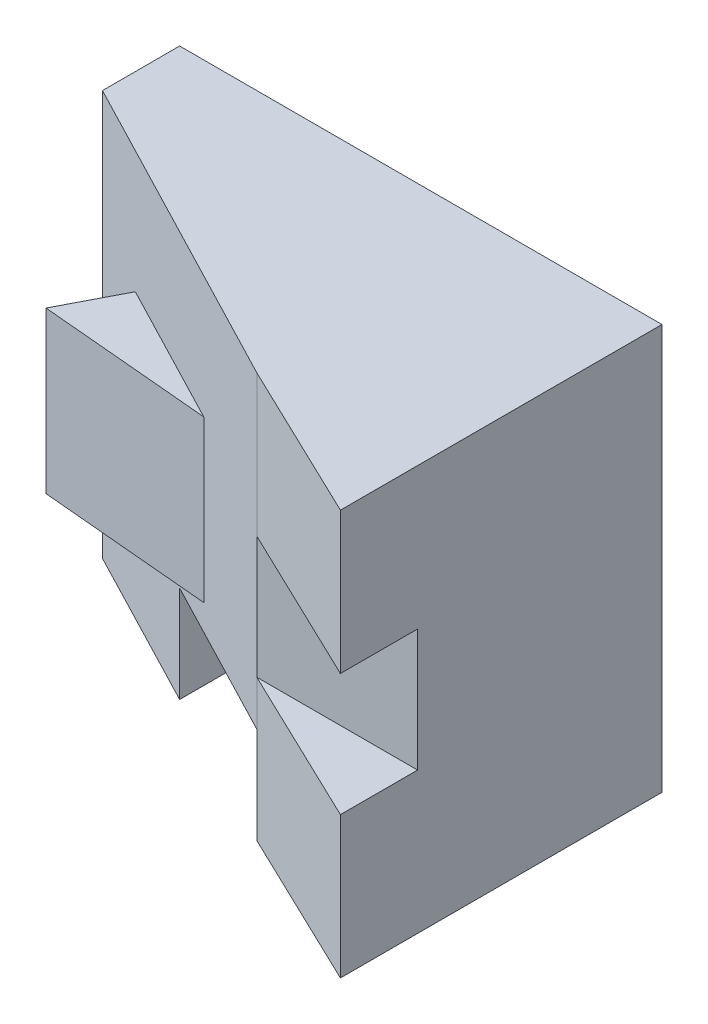
ISO-10303-21;
HEADER;
FILE_DESCRIPTION(('STEP AP214'),'2;1');
FILE_NAME('part.step','',(''),(''),'','','');
FILE_SCHEMA(('AUTOMOTIVE_DESIGN { 1 0 10303 214 1 1 1 1 }'));
ENDSEC;
DATA;
#1=APPLICATION_CONTEXT('core data for automotive mechanical design processes');
#2=APPLICATION_PROTOCOL_DEFINITION('international standard','automotive_design',2000,#1);
#3=PRODUCT_CONTEXT('',#1,'mechanical');
#4=PRODUCT('Part','Part','',(#3));
#5=PRODUCT_RELATED_PRODUCT_CATEGORY('part','',(#4));
#6=PRODUCT_DEFINITION_FORMATION('','',#4);
#7=PRODUCT_DEFINITION_CONTEXT('part definition',#1,'design');
#8=PRODUCT_DEFINITION('design','',#6,#7);
#9=PRODUCT_DEFINITION_SHAPE('','',#8);
#10=(LENGTH_UNIT() NAMED_UNIT(*) SI_UNIT(.MILLI.,.METRE.));
#11=(NAMED_UNIT(*) PLANE_ANGLE_UNIT() SI_UNIT($,.RADIAN.));
#12=(NAMED_UNIT(*) SI_UNIT($,.STERADIAN.) SOLID_ANGLE_UNIT());
#13=UNCERTAINTY_MEASURE_WITH_UNIT(LENGTH_MEASURE(1.E-05),#10,'distance_accuracy_value','');
#14=(GEOMETRIC_REPRESENTATION_CONTEXT(3) GLOBAL_UNCERTAINTY_ASSIGNED_CONTEXT((#13)) GLOBAL_UNIT_ASSIGNED_CONTEXT((#10,
#11,#12)) REPRESENTATION_CONTEXT('',''));
#15=CARTESIAN_POINT('',(0.,0.,0.));
#16=DIRECTION('',(0.,0.,1.));
#17=DIRECTION('',(1.,0.,0.));
#18=AXIS2_PLACEMENT_3D('',#15,#16,#17);
#19=CARTESIAN_POINT('',(25.,51.,25.));
#20=DIRECTION('',(0.46135273664199,0.,-0.887216801234595));
#21=DIRECTION('',(-0.887216801234595,0.,-0.46135273664199));
#22=AXIS2_PLACEMENT_3D('',#19,#20,#21);
#23=PLANE('',#22);
#24=DIRECTION('',(-0.887216801234595,0.,-0.46135273664199));
#25=VECTOR('',#24,1.);
#26=CARTESIAN_POINT('',(0.,0.,12.));
#27=LINE('',#26,#25);
#28=CARTESIAN_POINT('',(50.,0.,38.));
#29=VERTEX_POINT('',#28);
#30=CARTESIAN_POINT('',(0.,0.,12.));
#31=VERTEX_POINT('',#30);
#32=EDGE_CURVE('E217',#29,#31,#27,.T.);
#33=ORIENTED_EDGE('',*,*,#32,.T.);
#34=DIRECTION('',(0.,-1.,0.));
#35=VECTOR('',#34,1.);
#36=CARTESIAN_POINT('',(0.,51.,12.));
#37=LINE('',#36,#35);
#38=CARTESIAN_POINT('',(0.,-63.,12.));
#39=VERTEX_POINT('',#38);
#40=EDGE_CURVE('E215',#31,#39,#37,.T.);
#41=ORIENTED_EDGE('',*,*,#40,.T.);
#42=DIRECTION('',(0.887216801234595,0.,0.46135273664199));
#43=VECTOR('',#42,1.);
#44=CARTESIAN_POINT('',(25.,-63.,25.));
#45=LINE('',#44,#43);
#46=CARTESIAN_POINT('',(25.,-63.,25.));
#47=VERTEX_POINT('',#46);
#48=EDGE_CURVE('E207',#39,#47,#45,.T.);
#49=ORIENTED_EDGE('',*,*,#48,.T.);
#50=DIRECTION('',(0.,-1.,0.));
#51=VECTOR('',#50,1.);
#52=CARTESIAN_POINT('',(25.,0.,25.));
#53=LINE('',#52,#51);
#54=CARTESIAN_POINT('',(25.,-48.,25.));
#55=VERTEX_POINT('',#54);
#56=EDGE_CURVE('E222',#55,#47,#53,.T.);
#57=ORIENTED_EDGE('',*,*,#56,.F.);
#58=DIRECTION('',(-0.887216801234595,0.,-0.461352736641989));
#59=VECTOR('',#58,1.);
#60=CARTESIAN_POINT('',(25.,-48.,25.));
#61=LINE('',#60,#59);
#62=CARTESIAN_POINT('',(50.,-48.,38.));
#63=VERTEX_POINT('',#62);
#64=EDGE_CURVE('E176',#63,#55,#61,.T.);
#65=ORIENTED_EDGE('',*,*,#64,.F.);
#66=DIRECTION('',(0.,-1.,0.));
#67=VECTOR('',#66,1.);
#68=CARTESIAN_POINT('',(50.,0.,38.));
#69=LINE('',#68,#67);
#70=CARTESIAN_POINT('',(50.,-41.,38.));
#71=VERTEX_POINT('',#70);
#72=EDGE_CURVE('E208',#71,#63,#69,.T.);
#73=ORIENTED_EDGE('',*,*,#72,.F.);
#74=DIRECTION('',(0.,1.,0.));
#75=VECTOR('',#74,1.);
#76=CARTESIAN_POINT('',(50.,-41.,38.));
#77=LINE('',#76,#75);
#78=CARTESIAN_POINT('',(50.,-22.,38.));
#79=VERTEX_POINT('',#78);
#80=EDGE_CURVE('E168',#71,#79,#77,.T.);
#81=ORIENTED_EDGE('',*,*,#80,.T.);
#82=EDGE_CURVE('E204',#29,#79,#69,.T.);
#83=ORIENTED_EDGE('',*,*,#82,.F.);
#84=EDGE_LOOP('',(#33,#41,#49,#57,#65,#73,#81,#83));
#85=FACE_BOUND('',#84,.T.);
#86=DIRECTION('',(0.,-1.,0.));
#87=VECTOR('',#86,1.);
#88=CARTESIAN_POINT('',(10.6466016148151,-19.,17.5362328397039));
#89=LINE('',#88,#87);
#90=CARTESIAN_POINT('',(10.6466016148151,-19.,17.5362328397039));
#91=VERTEX_POINT('',#90);
#92=CARTESIAN_POINT('',(10.6466016148152,-44.,17.5362328397039));
#93=VERTEX_POINT('',#92);
#94=EDGE_CURVE('E157',#91,#93,#89,.T.);
#95=ORIENTED_EDGE('',*,*,#94,.F.);
#96=DIRECTION('',(-0.887216801234595,0.,-0.46135273664199));
#97=VECTOR('',#96,1.);
#98=CARTESIAN_POINT('',(10.6466016148151,-19.,17.5362328397039));
#99=LINE('',#98,#97);
#100=CARTESIAN_POINT('',(32.82702164568,-19.,29.0700512557536));
#101=VERTEX_POINT('',#100);
#102=EDGE_CURVE('E164',#101,#91,#99,.T.);
#103=ORIENTED_EDGE('',*,*,#102,.F.);
#104=DIRECTION('',(0.,1.,0.));
#105=VECTOR('',#104,1.);
#106=CARTESIAN_POINT('',(32.82702164568,-19.,29.0700512557536));
#107=LINE('',#106,#105);
#108=CARTESIAN_POINT('',(32.82702164568,-44.,29.0700512557536));
#109=VERTEX_POINT('',#108);
#110=EDGE_CURVE('E530',#109,#101,#107,.T.);
#111=ORIENTED_EDGE('',*,*,#110,.F.);
#112=DIRECTION('',(0.887216801234595,0.,0.46135273664199));
#113=VECTOR('',#112,1.);
#114=CARTESIAN_POINT('',(10.6466016148151,-44.,17.5362328397039));
#115=LINE('',#114,#113);
#116=EDGE_CURVE('E152',#93,#109,#115,.T.);
#117=ORIENTED_EDGE('',*,*,#116,.F.);
#118=EDGE_LOOP('',(#95,#103,#111,#117));
#119=FACE_BOUND('',#118,.T.);
#120=ADVANCED_FACE('F37',(#85,#119),#23,.F.);
#121=CARTESIAN_POINT('',(75.,0.,50.));
#122=DIRECTION('',(-0.432731067584771,0.,0.901523057468274));
#123=DIRECTION('',(0.901523057468274,0.,0.432731067584771));
#124=AXIS2_PLACEMENT_3D('',#121,#122,#123);
#125=PLANE('',#124);
#126=DIRECTION('',(-0.901523057468274,0.,-0.432731067584771));
#127=VECTOR('',#126,1.);
#128=CARTESIAN_POINT('',(75.,-22.,50.));
#129=LINE('',#128,#127);
#130=CARTESIAN_POINT('',(75.,-22.,50.));
#131=VERTEX_POINT('',#130);
#132=EDGE_CURVE('E11',#131,#79,#129,.T.);
#133=ORIENTED_EDGE('',*,*,#132,.F.);
#134=DIRECTION('',(0.,-1.,0.));
#135=VECTOR('',#134,1.);
#136=CARTESIAN_POINT('',(75.,0.,50.));
#137=LINE('',#136,#135);
#138=CARTESIAN_POINT('',(75.,0.,50.));
#139=VERTEX_POINT('',#138);
#140=EDGE_CURVE('E210',#139,#131,#137,.T.);
#141=ORIENTED_EDGE('',*,*,#140,.F.);
#142=DIRECTION('',(-0.901523057468274,0.,-0.432731067584771));
#143=VECTOR('',#142,1.);
#144=CARTESIAN_POINT('',(75.,0.,50.));
#145=LINE('',#144,#143);
#146=EDGE_CURVE('E196',#139,#29,#145,.T.);
#147=ORIENTED_EDGE('',*,*,#146,.T.);
#148=ORIENTED_EDGE('',*,*,#82,.T.);
#149=EDGE_LOOP('',(#133,#141,#147,#148));
#150=FACE_BOUND('',#149,.T.);
#151=ADVANCED_FACE('F277',(#150),#125,.T.);
#152=CARTESIAN_POINT('',(25.,0.,0.));
#153=DIRECTION('',(1.,0.,0.));
#154=DIRECTION('',(0.,0.,-1.));
#155=AXIS2_PLACEMENT_3D('',#152,#153,#154);
#156=PLANE('',#155);
#157=DIRECTION('',(0.,0.,-1.));
#158=VECTOR('',#157,1.);
#159=CARTESIAN_POINT('',(25.,-48.,12.));
#160=LINE('',#159,#158);
#161=CARTESIAN_POINT('',(25.,-48.,0.));
#162=VERTEX_POINT('',#161);
#163=EDGE_CURVE('E180',#55,#162,#160,.T.);
#164=ORIENTED_EDGE('',*,*,#163,.F.);
#165=ORIENTED_EDGE('',*,*,#56,.T.);
#166=DIRECTION('',(0.,0.,1.));
#167=VECTOR('',#166,1.);
#168=CARTESIAN_POINT('',(25.,-63.,0.));
#169=LINE('',#168,#167);
#170=CARTESIAN_POINT('',(25.,-63.,0.));
#171=VERTEX_POINT('',#170);
#172=EDGE_CURVE('E219',#171,#47,#169,.T.);
#173=ORIENTED_EDGE('',*,*,#172,.F.);
#174=DIRECTION('',(0.,-1.,0.));
#175=VECTOR('',#174,1.);
#176=CARTESIAN_POINT('',(25.,-48.,0.));
#177=LINE('',#176,#175);
#178=EDGE_CURVE('E189',#162,#171,#177,.T.);
#179=ORIENTED_EDGE('',*,*,#178,.F.);
#180=EDGE_LOOP('',(#164,#165,#173,#179));
#181=FACE_BOUND('',#180,.T.);
#182=ADVANCED_FACE('F299',(#181),#156,.T.);
#183=CARTESIAN_POINT('',(50.,0.,0.));
#184=DIRECTION('',(-1.,0.,0.));
#185=DIRECTION('',(0.,0.,1.));
#186=AXIS2_PLACEMENT_3D('',#183,#184,#185);
#187=PLANE('',#186);
#188=CARTESIAN_POINT('',(50.,-63.,38.));
#189=VERTEX_POINT('',#188);
#190=EDGE_CURVE('E209',#63,#189,#69,.T.);
#191=ORIENTED_EDGE('',*,*,#190,.F.);
#192=DIRECTION('',(0.,0.,1.));
#193=VECTOR('',#192,1.);
#194=CARTESIAN_POINT('',(50.,-48.,12.));
#195=LINE('',#194,#193);
#196=CARTESIAN_POINT('',(50.,-48.,0.));
#197=VERTEX_POINT('',#196);
#198=EDGE_CURVE('E186',#197,#63,#195,.T.);
#199=ORIENTED_EDGE('',*,*,#198,.F.);
#200=DIRECTION('',(0.,-1.,0.));
#201=VECTOR('',#200,1.);
#202=CARTESIAN_POINT('',(50.,-48.,0.));
#203=LINE('',#202,#201);
#204=CARTESIAN_POINT('',(50.,-63.,0.));
#205=VERTEX_POINT('',#204);
#206=EDGE_CURVE('E190',#197,#205,#203,.T.);
#207=ORIENTED_EDGE('',*,*,#206,.T.);
#208=DIRECTION('',(0.,0.,-1.));
#209=VECTOR('',#208,1.);
#210=CARTESIAN_POINT('',(50.,-63.,0.));
#211=LINE('',#210,#209);
#212=EDGE_CURVE('E200',#189,#205,#211,.T.);
#213=ORIENTED_EDGE('',*,*,#212,.F.);
#214=EDGE_LOOP('',(#191,#199,#207,#213));
#215=FACE_BOUND('',#214,.T.);
#216=ADVANCED_FACE('F305',(#215),#187,.T.);
#217=CARTESIAN_POINT('',(0.,-63.,12.));
#218=DIRECTION('',(0.,1.,0.));
#219=DIRECTION('',(0.,0.,1.));
#220=AXIS2_PLACEMENT_3D('',#217,#218,#219);
#221=PLANE('',#220);
#222=DIRECTION('',(1.,0.,0.));
#223=VECTOR('',#222,1.);
#224=CARTESIAN_POINT('',(0.,-63.,0.));
#225=LINE('',#224,#223);
#226=CARTESIAN_POINT('',(0.,-63.,0.));
#227=VERTEX_POINT('',#226);
#228=EDGE_CURVE('E225',#227,#171,#225,.T.);
#229=ORIENTED_EDGE('',*,*,#228,.T.);
#230=ORIENTED_EDGE('',*,*,#172,.T.);
#231=ORIENTED_EDGE('',*,*,#48,.F.);
#232=DIRECTION('',(0.,0.,-1.));
#233=VECTOR('',#232,1.);
#234=CARTESIAN_POINT('',(0.,-63.,12.));
#235=LINE('',#234,#233);
#236=EDGE_CURVE('E236',#39,#227,#235,.T.);
#237=ORIENTED_EDGE('',*,*,#236,.T.);
#238=EDGE_LOOP('',(#229,#230,#231,#237));
#239=FACE_BOUND('',#238,.T.);
#240=ADVANCED_FACE('F318',(#239),#221,.F.);
#241=ORIENTED_EDGE('',*,*,#212,.T.);
#242=CARTESIAN_POINT('',(75.,-63.,0.));
#243=VERTEX_POINT('',#242);
#244=EDGE_CURVE('E224',#205,#243,#225,.T.);
#245=ORIENTED_EDGE('',*,*,#244,.T.);
#246=DIRECTION('',(0.,0.,-1.));
#247=VECTOR('',#246,1.);
#248=CARTESIAN_POINT('',(75.,-63.,12.));
#249=LINE('',#248,#247);
#250=CARTESIAN_POINT('',(75.,-63.,50.));
#251=VERTEX_POINT('',#250);
#252=EDGE_CURVE('E243',#251,#243,#249,.T.);
#253=ORIENTED_EDGE('',*,*,#252,.F.);
#254=DIRECTION('',(-0.901523057468274,0.,-0.432731067584771));
#255=VECTOR('',#254,1.);
#256=CARTESIAN_POINT('',(75.,-63.,50.));
#257=LINE('',#256,#255);
#258=EDGE_CURVE('E193',#251,#189,#257,.T.);
#259=ORIENTED_EDGE('',*,*,#258,.T.);
#260=EDGE_LOOP('',(#241,#245,#253,#259));
#261=FACE_BOUND('',#260,.T.);
#262=ADVANCED_FACE('F39',(#261),#221,.F.);
#263=CARTESIAN_POINT('',(75.,0.,12.));
#264=DIRECTION('',(1.,0.,0.));
#265=DIRECTION('',(0.,0.,-1.));
#266=AXIS2_PLACEMENT_3D('',#263,#264,#265);
#267=PLANE('',#266);
#268=DIRECTION('',(0.,0.,1.));
#269=VECTOR('',#268,1.);
#270=CARTESIAN_POINT('',(75.,-22.,50.));
#271=LINE('',#270,#269);
#272=CARTESIAN_POINT('',(75.,-22.,38.));
#273=VERTEX_POINT('',#272);
#274=EDGE_CURVE('E171',#273,#131,#271,.T.);
#275=ORIENTED_EDGE('',*,*,#274,.F.);
#276=DIRECTION('',(0.,1.,0.));
#277=VECTOR('',#276,1.);
#278=CARTESIAN_POINT('',(75.,-41.,38.));
#279=LINE('',#278,#277);
#280=CARTESIAN_POINT('',(75.,-41.,38.));
#281=VERTEX_POINT('',#280);
#282=EDGE_CURVE('E162',#281,#273,#279,.T.);
#283=ORIENTED_EDGE('',*,*,#282,.F.);
#284=DIRECTION('',(0.,0.,-1.));
#285=VECTOR('',#284,1.);
#286=CARTESIAN_POINT('',(75.,-41.,50.));
#287=LINE('',#286,#285);
#288=CARTESIAN_POINT('',(75.,-41.,50.));
#289=VERTEX_POINT('',#288);
#290=EDGE_CURVE('E158',#289,#281,#287,.T.);
#291=ORIENTED_EDGE('',*,*,#290,.F.);
#292=EDGE_CURVE('E199',#289,#251,#137,.T.);
#293=ORIENTED_EDGE('',*,*,#292,.T.);
#294=ORIENTED_EDGE('',*,*,#252,.T.);
#295=DIRECTION('',(0.,-1.,0.));
#296=VECTOR('',#295,1.);
#297=CARTESIAN_POINT('',(75.,0.,0.));
#298=LINE('',#297,#296);
#299=CARTESIAN_POINT('',(75.,0.,0.));
#300=VERTEX_POINT('',#299);
#301=EDGE_CURVE('E228',#300,#243,#298,.T.);
#302=ORIENTED_EDGE('',*,*,#301,.F.);
#303=DIRECTION('',(0.,0.,-1.));
#304=VECTOR('',#303,1.);
#305=CARTESIAN_POINT('',(75.,0.,12.));
#306=LINE('',#305,#304);
#307=EDGE_CURVE('E240',#139,#300,#306,.T.);
#308=ORIENTED_EDGE('',*,*,#307,.F.);
#309=ORIENTED_EDGE('',*,*,#140,.T.);
#310=EDGE_LOOP('',(#275,#283,#291,#293,#294,#302,#308,#309));
#311=FACE_BOUND('',#310,.T.);
#312=ADVANCED_FACE('F255',(#311),#267,.T.);
#313=CARTESIAN_POINT('',(0.,0.,12.));
#314=DIRECTION('',(0.,1.,0.));
#315=DIRECTION('',(0.,0.,1.));
#316=AXIS2_PLACEMENT_3D('',#313,#314,#315);
#317=PLANE('',#316);
#318=ORIENTED_EDGE('',*,*,#32,.F.);
#319=ORIENTED_EDGE('',*,*,#146,.F.);
#320=ORIENTED_EDGE('',*,*,#307,.T.);
#321=DIRECTION('',(1.,0.,0.));
#322=VECTOR('',#321,1.);
#323=CARTESIAN_POINT('',(0.,0.,0.));
#324=LINE('',#323,#322);
#325=CARTESIAN_POINT('',(0.,0.,0.));
#326=VERTEX_POINT('',#325);
#327=EDGE_CURVE('E231',#326,#300,#324,.T.);
#328=ORIENTED_EDGE('',*,*,#327,.F.);
#329=DIRECTION('',(0.,0.,-1.));
#330=VECTOR('',#329,1.);
#331=CARTESIAN_POINT('',(0.,0.,12.));
#332=LINE('',#331,#330);
#333=EDGE_CURVE('E238',#31,#326,#332,.T.);
#334=ORIENTED_EDGE('',*,*,#333,.F.);
#335=EDGE_LOOP('',(#318,#319,#320,#328,#334));
#336=FACE_BOUND('',#335,.T.);
#337=ADVANCED_FACE('F273',(#336),#317,.T.);
#338=CARTESIAN_POINT('',(0.,0.,12.));
#339=DIRECTION('',(1.,0.,0.));
#340=DIRECTION('',(0.,0.,-1.));
#341=AXIS2_PLACEMENT_3D('',#338,#339,#340);
#342=PLANE('',#341);
#343=ORIENTED_EDGE('',*,*,#236,.F.);
#344=ORIENTED_EDGE('',*,*,#40,.F.);
#345=ORIENTED_EDGE('',*,*,#333,.T.);
#346=DIRECTION('',(0.,-1.,0.));
#347=VECTOR('',#346,1.);
#348=CARTESIAN_POINT('',(0.,0.,0.));
#349=LINE('',#348,#347);
#350=EDGE_CURVE('E233',#326,#227,#349,.T.);
#351=ORIENTED_EDGE('',*,*,#350,.T.);
#352=EDGE_LOOP('',(#343,#344,#345,#351));
#353=FACE_BOUND('',#352,.T.);
#354=ADVANCED_FACE('F309',(#353),#342,.F.);
#355=CARTESIAN_POINT('',(0.,0.,0.));
#356=DIRECTION('',(0.,0.,-1.));
#357=DIRECTION('',(-1.,0.,0.));
#358=AXIS2_PLACEMENT_3D('',#355,#356,#357);
#359=PLANE('',#358);
#360=ORIENTED_EDGE('',*,*,#178,.T.);
#361=ORIENTED_EDGE('',*,*,#228,.F.);
#362=ORIENTED_EDGE('',*,*,#350,.F.);
#363=ORIENTED_EDGE('',*,*,#327,.T.);
#364=ORIENTED_EDGE('',*,*,#301,.T.);
#365=ORIENTED_EDGE('',*,*,#244,.F.);
#366=ORIENTED_EDGE('',*,*,#206,.F.);
#367=DIRECTION('',(1.,0.,0.));
#368=VECTOR('',#367,1.);
#369=CARTESIAN_POINT('',(25.,-48.,0.));
#370=LINE('',#369,#368);
#371=EDGE_CURVE('E183',#162,#197,#370,.T.);
#372=ORIENTED_EDGE('',*,*,#371,.F.);
#373=EDGE_LOOP('',(#360,#361,#362,#363,#364,#365,#366,#372));
#374=FACE_BOUND('',#373,.T.);
#375=ADVANCED_FACE('F265',(#374),#359,.T.);
#376=DIRECTION('',(0.901523057468274,0.,0.432731067584771));
#377=VECTOR('',#376,1.);
#378=CARTESIAN_POINT('',(75.,-41.,50.));
#379=LINE('',#378,#377);
#380=EDGE_CURVE('E45',#71,#289,#379,.T.);
#381=ORIENTED_EDGE('',*,*,#380,.F.);
#382=ORIENTED_EDGE('',*,*,#72,.T.);
#383=ORIENTED_EDGE('',*,*,#190,.T.);
#384=ORIENTED_EDGE('',*,*,#258,.F.);
#385=ORIENTED_EDGE('',*,*,#292,.F.);
#386=EDGE_LOOP('',(#381,#382,#383,#384,#385));
#387=FACE_BOUND('',#386,.T.);
#388=ADVANCED_FACE('F258',(#387),#125,.T.);
#389=CARTESIAN_POINT('',(0.,-48.,0.));
#390=DIRECTION('',(0.,-1.,0.));
#391=DIRECTION('',(0.,0.,-1.));
#392=AXIS2_PLACEMENT_3D('',#389,#390,#391);
#393=PLANE('',#392);
#394=ORIENTED_EDGE('',*,*,#163,.T.);
#395=ORIENTED_EDGE('',*,*,#371,.T.);
#396=ORIENTED_EDGE('',*,*,#198,.T.);
#397=ORIENTED_EDGE('',*,*,#64,.T.);
#398=EDGE_LOOP('',(#394,#395,#396,#397));
#399=FACE_BOUND('',#398,.T.);
#400=ADVANCED_FACE('F292',(#399),#393,.T.);
#401=CARTESIAN_POINT('',(50.,-22.,50.));
#402=DIRECTION('',(0.,1.,0.));
#403=DIRECTION('',(0.,0.,1.));
#404=AXIS2_PLACEMENT_3D('',#401,#402,#403);
#405=PLANE('',#404);
#406=ORIENTED_EDGE('',*,*,#132,.T.);
#407=DIRECTION('',(1.,0.,0.));
#408=VECTOR('',#407,1.);
#409=CARTESIAN_POINT('',(50.,-22.,38.));
#410=LINE('',#409,#408);
#411=EDGE_CURVE('E60',#79,#273,#410,.T.);
#412=ORIENTED_EDGE('',*,*,#411,.T.);
#413=ORIENTED_EDGE('',*,*,#274,.T.);
#414=EDGE_LOOP('',(#406,#412,#413));
#415=FACE_BOUND('',#414,.T.);
#416=ADVANCED_FACE('F280',(#415),#405,.F.);
#417=CARTESIAN_POINT('',(50.,-41.,38.));
#418=DIRECTION('',(0.,0.,-1.));
#419=DIRECTION('',(-1.,0.,0.));
#420=AXIS2_PLACEMENT_3D('',#417,#418,#419);
#421=PLANE('',#420);
#422=ORIENTED_EDGE('',*,*,#282,.T.);
#423=ORIENTED_EDGE('',*,*,#411,.F.);
#424=ORIENTED_EDGE('',*,*,#80,.F.);
#425=DIRECTION('',(1.,0.,0.));
#426=VECTOR('',#425,1.);
#427=CARTESIAN_POINT('',(50.,-41.,38.));
#428=LINE('',#427,#426);
#429=EDGE_CURVE('E170',#71,#281,#428,.T.);
#430=ORIENTED_EDGE('',*,*,#429,.T.);
#431=EDGE_LOOP('',(#422,#423,#424,#430));
#432=FACE_BOUND('',#431,.T.);
#433=ADVANCED_FACE('F284',(#432),#421,.F.);
#434=CARTESIAN_POINT('',(50.,-41.,50.));
#435=DIRECTION('',(0.,-1.,0.));
#436=DIRECTION('',(0.,0.,-1.));
#437=AXIS2_PLACEMENT_3D('',#434,#435,#436);
#438=PLANE('',#437);
#439=ORIENTED_EDGE('',*,*,#380,.T.);
#440=ORIENTED_EDGE('',*,*,#290,.T.);
#441=ORIENTED_EDGE('',*,*,#429,.F.);
#442=EDGE_LOOP('',(#439,#440,#441));
#443=FACE_BOUND('',#442,.T.);
#444=ADVANCED_FACE('F248',(#443),#438,.F.);
#445=CARTESIAN_POINT('',(-9.65291879743241,-19.,56.5737720940261));
#446=DIRECTION('',(0.887216801234595,0.,0.46135273664199));
#447=DIRECTION('',(0.46135273664199,0.,-0.887216801234595));
#448=AXIS2_PLACEMENT_3D('',#445,#446,#447);
#449=PLANE('',#448);
#450=DIRECTION('',(0.46135273664199,0.,-0.887216801234595));
#451=VECTOR('',#450,1.);
#452=CARTESIAN_POINT('',(-9.65291879743241,-44.,56.5737720940261));
#453=LINE('',#452,#451);
#454=CARTESIAN_POINT('',(5.89621862754158,-44.,26.6715847383069));
#455=VERTEX_POINT('',#454);
#456=EDGE_CURVE('E52',#455,#93,#453,.T.);
#457=ORIENTED_EDGE('',*,*,#456,.F.);
#458=DIRECTION('',(0.,-1.,0.));
#459=VECTOR('',#458,1.);
#460=CARTESIAN_POINT('',(5.89621862754158,0.,26.6715847383069));
#461=LINE('',#460,#459);
#462=CARTESIAN_POINT('',(5.89621862754158,-19.,26.6715847383069));
#463=VERTEX_POINT('',#462);
#464=EDGE_CURVE('E142',#463,#455,#461,.T.);
#465=ORIENTED_EDGE('',*,*,#464,.F.);
#466=DIRECTION('',(0.46135273664199,0.,-0.887216801234595));
#467=VECTOR('',#466,1.);
#468=CARTESIAN_POINT('',(-9.65291879743241,-19.,56.5737720940261));
#469=LINE('',#468,#467);
#470=EDGE_CURVE('E159',#463,#91,#469,.T.);
#471=ORIENTED_EDGE('',*,*,#470,.T.);
#472=ORIENTED_EDGE('',*,*,#94,.T.);
#473=EDGE_LOOP('',(#457,#465,#471,#472));
#474=FACE_BOUND('',#473,.T.);
#475=ADVANCED_FACE('F155',(#474),#449,.F.);
#476=CARTESIAN_POINT('',(-9.65291879743241,-44.,56.5737720940261));
#477=DIRECTION('',(0.,1.,0.));
#478=DIRECTION('',(0.,0.,1.));
#479=AXIS2_PLACEMENT_3D('',#476,#477,#478);
#480=PLANE('',#479);
#481=ORIENTED_EDGE('',*,*,#116,.T.);
#482=DIRECTION('',(0.996057565122305,0.,0.0887092270433343));
#483=VECTOR('',#482,1.);
#484=CARTESIAN_POINT('',(32.82702164568,-44.,29.0700512557536));
#485=LINE('',#484,#483);
#486=EDGE_CURVE('E144',#455,#109,#485,.T.);
#487=ORIENTED_EDGE('',*,*,#486,.F.);
#488=ORIENTED_EDGE('',*,*,#456,.T.);
#489=EDGE_LOOP('',(#481,#487,#488));
#490=FACE_BOUND('',#489,.T.);
#491=ADVANCED_FACE('F151',(#490),#480,.F.);
#492=CARTESIAN_POINT('',(-9.65291879743241,-19.,56.5737720940261));
#493=DIRECTION('',(0.,-1.,0.));
#494=DIRECTION('',(0.,0.,-1.));
#495=AXIS2_PLACEMENT_3D('',#492,#493,#494);
#496=PLANE('',#495);
#497=ORIENTED_EDGE('',*,*,#470,.F.);
#498=DIRECTION('',(0.996057565122305,0.,0.0887092270433343));
#499=VECTOR('',#498,1.);
#500=CARTESIAN_POINT('',(-6.88841532628737,-19.,25.532980870631));
#501=LINE('',#500,#499);
#502=EDGE_CURVE('E147',#463,#101,#501,.T.);
#503=ORIENTED_EDGE('',*,*,#502,.T.);
#504=ORIENTED_EDGE('',*,*,#102,.T.);
#505=EDGE_LOOP('',(#497,#503,#504));
#506=FACE_BOUND('',#505,.T.);
#507=ADVANCED_FACE('F379',(#506),#496,.F.);
#508=CARTESIAN_POINT('',(32.82702164568,0.,29.0700512557536));
#509=DIRECTION('',(0.0887092270433343,0.,-0.996057565122305));
#510=DIRECTION('',(-0.996057565122305,0.,-0.0887092270433343));
#511=AXIS2_PLACEMENT_3D('',#508,#509,#510);
#512=PLANE('',#511);
#513=ORIENTED_EDGE('',*,*,#464,.T.);
#514=ORIENTED_EDGE('',*,*,#486,.T.);
#515=ORIENTED_EDGE('',*,*,#110,.T.);
#516=ORIENTED_EDGE('',*,*,#502,.F.);
#517=EDGE_LOOP('',(#513,#514,#515,#516));
#518=FACE_BOUND('',#517,.T.);
#519=ADVANCED_FACE('F143',(#518),#512,.F.);
#520=CLOSED_SHELL('',(#120,#151,#182,#216,#240,#262,#312,#337,#354,#375,#388,#400,#416,#433,
#444,#475,#491,#507,#519));
#521=MANIFOLD_SOLID_BREP('B2',#520);
#522=ADVANCED_BREP_SHAPE_REPRESENTATION('',(#18,#521),#14);
#523=SHAPE_DEFINITION_REPRESENTATION(#9,#522);
ENDSEC;
END-ISO-10303-21;
